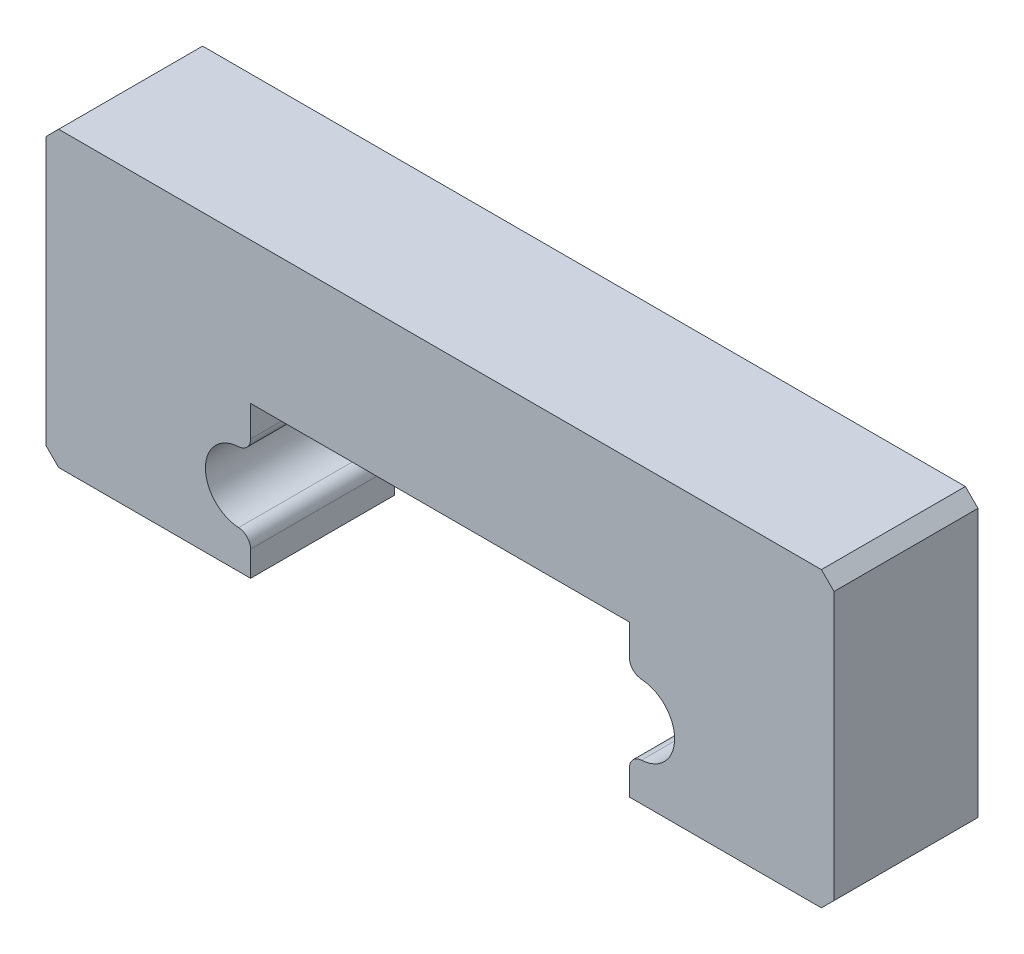
ISO-10303-21;
HEADER;
FILE_DESCRIPTION(('STEP AP214'),'2;1');
FILE_NAME('part.step','',(''),(''),'','','');
FILE_SCHEMA(('AUTOMOTIVE_DESIGN { 1 0 10303 214 1 1 1 1 }'));
ENDSEC;
DATA;
#1=APPLICATION_CONTEXT('core data for automotive mechanical design processes');
#2=APPLICATION_PROTOCOL_DEFINITION('international standard','automotive_design',2000,#1);
#3=PRODUCT_CONTEXT('',#1,'mechanical');
#4=PRODUCT('Part','Part','',(#3));
#5=PRODUCT_RELATED_PRODUCT_CATEGORY('part','',(#4));
#6=PRODUCT_DEFINITION_FORMATION('','',#4);
#7=PRODUCT_DEFINITION_CONTEXT('part definition',#1,'design');
#8=PRODUCT_DEFINITION('design','',#6,#7);
#9=PRODUCT_DEFINITION_SHAPE('','',#8);
#10=(LENGTH_UNIT() NAMED_UNIT(*) SI_UNIT(.MILLI.,.METRE.));
#11=(NAMED_UNIT(*) PLANE_ANGLE_UNIT() SI_UNIT($,.RADIAN.));
#12=(NAMED_UNIT(*) SI_UNIT($,.STERADIAN.) SOLID_ANGLE_UNIT());
#13=UNCERTAINTY_MEASURE_WITH_UNIT(LENGTH_MEASURE(1.E-05),#10,'distance_accuracy_value','');
#14=(GEOMETRIC_REPRESENTATION_CONTEXT(3) GLOBAL_UNCERTAINTY_ASSIGNED_CONTEXT((#13)) GLOBAL_UNIT_ASSIGNED_CONTEXT((#10,
#11,#12)) REPRESENTATION_CONTEXT('',''));
#15=CARTESIAN_POINT('',(0.,0.,0.));
#16=DIRECTION('',(0.,0.,1.));
#17=DIRECTION('',(1.,0.,0.));
#18=AXIS2_PLACEMENT_3D('',#15,#16,#17);
#19=CARTESIAN_POINT('',(7.5,0.,-5.7));
#20=DIRECTION('',(1.,0.,0.));
#21=DIRECTION('',(0.,1.,0.));
#22=AXIS2_PLACEMENT_3D('',#19,#20,#21);
#23=PLANE('',#22);
#24=DIRECTION('',(0.,1.,0.));
#25=VECTOR('',#24,1.);
#26=CARTESIAN_POINT('',(7.5,0.,-5.7));
#27=LINE('',#26,#25);
#28=CARTESIAN_POINT('',(7.5,-1.02364876017217,-5.7));
#29=VERTEX_POINT('',#28);
#30=CARTESIAN_POINT('',(7.5,0.200000000000002,-5.7));
#31=VERTEX_POINT('',#30);
#32=EDGE_CURVE('E274',#29,#31,#27,.T.);
#33=ORIENTED_EDGE('',*,*,#32,.F.);
#34=DIRECTION('',(0.,0.,-1.));
#35=VECTOR('',#34,1.);
#36=CARTESIAN_POINT('',(7.5,-1.02364876017217,0.));
#37=LINE('',#36,#35);
#38=CARTESIAN_POINT('',(7.5,-1.02364876017217,0.));
#39=VERTEX_POINT('',#38);
#40=EDGE_CURVE('E278',#29,#39,#37,.F.);
#41=ORIENTED_EDGE('',*,*,#40,.T.);
#42=DIRECTION('',(0.,1.,0.));
#43=VECTOR('',#42,1.);
#44=CARTESIAN_POINT('',(7.5,0.,0.));
#45=LINE('',#44,#43);
#46=CARTESIAN_POINT('',(7.5,0.200000000000002,0.));
#47=VERTEX_POINT('',#46);
#48=EDGE_CURVE('E235',#39,#47,#45,.T.);
#49=ORIENTED_EDGE('',*,*,#48,.T.);
#50=DIRECTION('',(0.,0.,1.));
#51=VECTOR('',#50,1.);
#52=CARTESIAN_POINT('',(7.5,0.200000000000002,-5.7));
#53=LINE('',#52,#51);
#54=EDGE_CURVE('E275',#31,#47,#53,.T.);
#55=ORIENTED_EDGE('',*,*,#54,.F.);
#56=EDGE_LOOP('',(#33,#41,#49,#55));
#57=FACE_BOUND('',#56,.T.);
#58=ADVANCED_FACE('F45',(#57),#23,.F.);
#59=CARTESIAN_POINT('',(0.,0.200000000000001,-5.7));
#60=DIRECTION('',(0.,-1.,0.));
#61=DIRECTION('',(1.,0.,0.));
#62=AXIS2_PLACEMENT_3D('',#59,#60,#61);
#63=PLANE('',#62);
#64=DIRECTION('',(1.,0.,0.));
#65=VECTOR('',#64,1.);
#66=CARTESIAN_POINT('',(0.,0.200000000000001,0.));
#67=LINE('',#66,#65);
#68=CARTESIAN_POINT('',(-7.5,0.200000000000001,0.));
#69=VERTEX_POINT('',#68);
#70=EDGE_CURVE('E271',#69,#47,#67,.T.);
#71=ORIENTED_EDGE('',*,*,#70,.F.);
#72=DIRECTION('',(0.,0.,1.));
#73=VECTOR('',#72,1.);
#74=CARTESIAN_POINT('',(-7.5,0.200000000000001,-5.7));
#75=LINE('',#74,#73);
#76=CARTESIAN_POINT('',(-7.5,0.200000000000001,-5.7));
#77=VERTEX_POINT('',#76);
#78=EDGE_CURVE('E279',#77,#69,#75,.T.);
#79=ORIENTED_EDGE('',*,*,#78,.F.);
#80=DIRECTION('',(1.,0.,0.));
#81=VECTOR('',#80,1.);
#82=CARTESIAN_POINT('',(0.,0.200000000000001,-5.7));
#83=LINE('',#82,#81);
#84=EDGE_CURVE('E194',#77,#31,#83,.T.);
#85=ORIENTED_EDGE('',*,*,#84,.T.);
#86=ORIENTED_EDGE('',*,*,#54,.T.);
#87=EDGE_LOOP('',(#71,#79,#85,#86));
#88=FACE_BOUND('',#87,.T.);
#89=ADVANCED_FACE('F405',(#88),#63,.T.);
#90=CARTESIAN_POINT('',(-7.5,0.,-5.7));
#91=DIRECTION('',(1.,0.,0.));
#92=DIRECTION('',(0.,1.,0.));
#93=AXIS2_PLACEMENT_3D('',#90,#91,#92);
#94=PLANE('',#93);
#95=DIRECTION('',(0.,1.,0.));
#96=VECTOR('',#95,1.);
#97=CARTESIAN_POINT('',(-7.5,0.,0.));
#98=LINE('',#97,#96);
#99=CARTESIAN_POINT('',(-7.5,-1.02364876017217,0.));
#100=VERTEX_POINT('',#99);
#101=EDGE_CURVE('E269',#100,#69,#98,.T.);
#102=ORIENTED_EDGE('',*,*,#101,.F.);
#103=DIRECTION('',(0.,0.,-1.));
#104=VECTOR('',#103,1.);
#105=CARTESIAN_POINT('',(-7.5,-1.02364876017217,-5.7));
#106=LINE('',#105,#104);
#107=CARTESIAN_POINT('',(-7.5,-1.02364876017217,-5.7));
#108=VERTEX_POINT('',#107);
#109=EDGE_CURVE('E53',#100,#108,#106,.T.);
#110=ORIENTED_EDGE('',*,*,#109,.T.);
#111=DIRECTION('',(0.,1.,0.));
#112=VECTOR('',#111,1.);
#113=CARTESIAN_POINT('',(-7.5,0.,-5.7));
#114=LINE('',#113,#112);
#115=EDGE_CURVE('E231',#108,#77,#114,.T.);
#116=ORIENTED_EDGE('',*,*,#115,.T.);
#117=ORIENTED_EDGE('',*,*,#78,.T.);
#118=EDGE_LOOP('',(#102,#110,#116,#117));
#119=FACE_BOUND('',#118,.T.);
#120=ADVANCED_FACE('F334',(#119),#94,.T.);
#121=CARTESIAN_POINT('',(-7.9,-2.91,-5.7));
#122=DIRECTION('',(0.,0.,1.));
#123=DIRECTION('',(1.,0.,0.));
#124=AXIS2_PLACEMENT_3D('',#121,#122,#123);
#125=CYLINDRICAL_SURFACE('',#124,1.389);
#126=CARTESIAN_POINT('',(-7.9,-2.91,-5.7));
#127=DIRECTION('',(0.,0.,1.));
#128=DIRECTION('',(1.,0.,0.));
#129=AXIS2_PLACEMENT_3D('',#126,#127,#128);
#130=CIRCLE('',#129,1.389);
#131=CARTESIAN_POINT('',(-7.97353096876654,-1.5229476590149,-5.7));
#132=VERTEX_POINT('',#131);
#133=CARTESIAN_POINT('',(-7.97353096876654,-4.2970523409851,-5.7));
#134=VERTEX_POINT('',#133);
#135=EDGE_CURVE('E229',#132,#134,#130,.T.);
#136=ORIENTED_EDGE('',*,*,#135,.F.);
#137=DIRECTION('',(0.,0.,1.));
#138=VECTOR('',#137,1.);
#139=CARTESIAN_POINT('',(-7.97353096876654,-1.5229476590149,-5.7));
#140=LINE('',#139,#138);
#141=CARTESIAN_POINT('',(-7.97353096876654,-1.5229476590149,0.));
#142=VERTEX_POINT('',#141);
#143=EDGE_CURVE('E328',#132,#142,#140,.T.);
#144=ORIENTED_EDGE('',*,*,#143,.T.);
#145=CARTESIAN_POINT('',(-7.9,-2.91,0.));
#146=DIRECTION('',(0.,0.,1.));
#147=DIRECTION('',(1.,0.,0.));
#148=AXIS2_PLACEMENT_3D('',#145,#146,#147);
#149=CIRCLE('',#148,1.389);
#150=CARTESIAN_POINT('',(-7.97353096876654,-4.2970523409851,0.));
#151=VERTEX_POINT('',#150);
#152=EDGE_CURVE('E266',#142,#151,#149,.T.);
#153=ORIENTED_EDGE('',*,*,#152,.T.);
#154=DIRECTION('',(0.,0.,1.));
#155=VECTOR('',#154,1.);
#156=CARTESIAN_POINT('',(-7.97353096876654,-4.2970523409851,-5.7));
#157=LINE('',#156,#155);
#158=EDGE_CURVE('E326',#151,#134,#157,.F.);
#159=ORIENTED_EDGE('',*,*,#158,.T.);
#160=EDGE_LOOP('',(#136,#144,#153,#159));
#161=FACE_BOUND('',#160,.T.);
#162=ADVANCED_FACE('F344',(#161),#125,.F.);
#163=CARTESIAN_POINT('',(-7.5,0.,-5.7));
#164=DIRECTION('',(1.,0.,0.));
#165=DIRECTION('',(0.,0.,-1.));
#166=AXIS2_PLACEMENT_3D('',#163,#164,#165);
#167=PLANE('',#166);
#168=DIRECTION('',(0.,1.,0.));
#169=VECTOR('',#168,1.);
#170=CARTESIAN_POINT('',(-7.5,0.,-5.7));
#171=LINE('',#170,#169);
#172=CARTESIAN_POINT('',(-7.5,-5.8,-5.7));
#173=VERTEX_POINT('',#172);
#174=CARTESIAN_POINT('',(-7.5,-4.79635123982783,-5.7));
#175=VERTEX_POINT('',#174);
#176=EDGE_CURVE('E227',#173,#175,#171,.T.);
#177=ORIENTED_EDGE('',*,*,#176,.T.);
#178=DIRECTION('',(0.,0.,-1.));
#179=VECTOR('',#178,1.);
#180=CARTESIAN_POINT('',(-7.5,-4.79635123982783,0.));
#181=LINE('',#180,#179);
#182=CARTESIAN_POINT('',(-7.5,-4.79635123982783,0.));
#183=VERTEX_POINT('',#182);
#184=EDGE_CURVE('E11',#175,#183,#181,.F.);
#185=ORIENTED_EDGE('',*,*,#184,.T.);
#186=DIRECTION('',(0.,1.,0.));
#187=VECTOR('',#186,1.);
#188=CARTESIAN_POINT('',(-7.5,0.,0.));
#189=LINE('',#188,#187);
#190=CARTESIAN_POINT('',(-7.5,-5.8,0.));
#191=VERTEX_POINT('',#190);
#192=EDGE_CURVE('E263',#191,#183,#189,.T.);
#193=ORIENTED_EDGE('',*,*,#192,.F.);
#194=DIRECTION('',(0.,0.,1.));
#195=VECTOR('',#194,1.);
#196=CARTESIAN_POINT('',(-7.5,-5.8,-5.7));
#197=LINE('',#196,#195);
#198=EDGE_CURVE('E282',#173,#191,#197,.T.);
#199=ORIENTED_EDGE('',*,*,#198,.F.);
#200=EDGE_LOOP('',(#177,#185,#193,#199));
#201=FACE_BOUND('',#200,.T.);
#202=ADVANCED_FACE('F354',(#201),#167,.T.);
#203=CARTESIAN_POINT('',(0.,-5.8,-5.7));
#204=DIRECTION('',(0.,1.,0.));
#205=DIRECTION('',(-1.,0.,0.));
#206=AXIS2_PLACEMENT_3D('',#203,#204,#205);
#207=PLANE('',#206);
#208=DIRECTION('',(-1.,0.,0.));
#209=VECTOR('',#208,1.);
#210=CARTESIAN_POINT('',(0.,-5.8,0.));
#211=LINE('',#210,#209);
#212=CARTESIAN_POINT('',(-15.1,-5.8,0.));
#213=VERTEX_POINT('',#212);
#214=EDGE_CURVE('E261',#191,#213,#211,.T.);
#215=ORIENTED_EDGE('',*,*,#214,.T.);
#216=DIRECTION('',(0.,0.,1.));
#217=VECTOR('',#216,1.);
#218=CARTESIAN_POINT('',(-15.1,-5.8,-5.7));
#219=LINE('',#218,#217);
#220=CARTESIAN_POINT('',(-15.1,-5.8,-5.7));
#221=VERTEX_POINT('',#220);
#222=EDGE_CURVE('E284',#221,#213,#219,.T.);
#223=ORIENTED_EDGE('',*,*,#222,.F.);
#224=DIRECTION('',(-1.,0.,0.));
#225=VECTOR('',#224,1.);
#226=CARTESIAN_POINT('',(0.,-5.8,-5.7));
#227=LINE('',#226,#225);
#228=EDGE_CURVE('E225',#173,#221,#227,.T.);
#229=ORIENTED_EDGE('',*,*,#228,.F.);
#230=ORIENTED_EDGE('',*,*,#198,.T.);
#231=EDGE_LOOP('',(#215,#223,#229,#230));
#232=FACE_BOUND('',#231,.T.);
#233=ADVANCED_FACE('F360',(#232),#207,.F.);
#234=CARTESIAN_POINT('',(-10.45,-10.45,-5.7));
#235=DIRECTION('',(0.707106781186547,0.707106781186548,0.));
#236=DIRECTION('',(-0.707106781186548,0.707106781186547,0.));
#237=AXIS2_PLACEMENT_3D('',#234,#235,#236);
#238=PLANE('',#237);
#239=DIRECTION('',(-0.707106781186548,0.707106781186547,0.));
#240=VECTOR('',#239,1.);
#241=CARTESIAN_POINT('',(-10.45,-10.45,0.));
#242=LINE('',#241,#240);
#243=CARTESIAN_POINT('',(-15.6,-5.3,0.));
#244=VERTEX_POINT('',#243);
#245=EDGE_CURVE('E259',#213,#244,#242,.T.);
#246=ORIENTED_EDGE('',*,*,#245,.T.);
#247=DIRECTION('',(0.,0.,1.));
#248=VECTOR('',#247,1.);
#249=CARTESIAN_POINT('',(-15.6,-5.3,-5.7));
#250=LINE('',#249,#248);
#251=CARTESIAN_POINT('',(-15.6,-5.3,-5.7));
#252=VERTEX_POINT('',#251);
#253=EDGE_CURVE('E287',#252,#244,#250,.T.);
#254=ORIENTED_EDGE('',*,*,#253,.F.);
#255=DIRECTION('',(-0.707106781186548,0.707106781186547,0.));
#256=VECTOR('',#255,1.);
#257=CARTESIAN_POINT('',(-10.45,-10.45,-5.7));
#258=LINE('',#257,#256);
#259=EDGE_CURVE('E223',#221,#252,#258,.T.);
#260=ORIENTED_EDGE('',*,*,#259,.F.);
#261=ORIENTED_EDGE('',*,*,#222,.T.);
#262=EDGE_LOOP('',(#246,#254,#260,#261));
#263=FACE_BOUND('',#262,.T.);
#264=ADVANCED_FACE('F363',(#263),#238,.F.);
#265=CARTESIAN_POINT('',(-15.6,0.,-5.7));
#266=DIRECTION('',(1.,0.,0.));
#267=DIRECTION('',(0.,0.,-1.));
#268=AXIS2_PLACEMENT_3D('',#265,#266,#267);
#269=PLANE('',#268);
#270=DIRECTION('',(0.,1.,0.));
#271=VECTOR('',#270,1.);
#272=CARTESIAN_POINT('',(-15.6,0.,0.));
#273=LINE('',#272,#271);
#274=CARTESIAN_POINT('',(-15.6,5.3,0.));
#275=VERTEX_POINT('',#274);
#276=EDGE_CURVE('E257',#244,#275,#273,.T.);
#277=ORIENTED_EDGE('',*,*,#276,.T.);
#278=DIRECTION('',(0.,0.,1.));
#279=VECTOR('',#278,1.);
#280=CARTESIAN_POINT('',(-15.6,5.3,-5.7));
#281=LINE('',#280,#279);
#282=CARTESIAN_POINT('',(-15.6,5.3,-5.7));
#283=VERTEX_POINT('',#282);
#284=EDGE_CURVE('E290',#283,#275,#281,.T.);
#285=ORIENTED_EDGE('',*,*,#284,.F.);
#286=DIRECTION('',(0.,1.,0.));
#287=VECTOR('',#286,1.);
#288=CARTESIAN_POINT('',(-15.6,0.,-5.7));
#289=LINE('',#288,#287);
#290=EDGE_CURVE('E221',#252,#283,#289,.T.);
#291=ORIENTED_EDGE('',*,*,#290,.F.);
#292=ORIENTED_EDGE('',*,*,#253,.T.);
#293=EDGE_LOOP('',(#277,#285,#291,#292));
#294=FACE_BOUND('',#293,.T.);
#295=ADVANCED_FACE('F368',(#294),#269,.F.);
#296=CARTESIAN_POINT('',(-10.45,10.45,-5.7));
#297=DIRECTION('',(0.707106781186547,-0.707106781186547,0.));
#298=DIRECTION('',(0.707106781186548,0.707106781186548,0.));
#299=AXIS2_PLACEMENT_3D('',#296,#297,#298);
#300=PLANE('',#299);
#301=DIRECTION('',(0.707106781186548,0.707106781186548,0.));
#302=VECTOR('',#301,1.);
#303=CARTESIAN_POINT('',(-10.45,10.45,0.));
#304=LINE('',#303,#302);
#305=CARTESIAN_POINT('',(-15.1,5.8,0.));
#306=VERTEX_POINT('',#305);
#307=EDGE_CURVE('E255',#275,#306,#304,.T.);
#308=ORIENTED_EDGE('',*,*,#307,.T.);
#309=DIRECTION('',(0.,0.,1.));
#310=VECTOR('',#309,1.);
#311=CARTESIAN_POINT('',(-15.1,5.8,-5.7));
#312=LINE('',#311,#310);
#313=CARTESIAN_POINT('',(-15.1,5.8,-5.7));
#314=VERTEX_POINT('',#313);
#315=EDGE_CURVE('E293',#314,#306,#312,.T.);
#316=ORIENTED_EDGE('',*,*,#315,.F.);
#317=DIRECTION('',(0.707106781186548,0.707106781186548,0.));
#318=VECTOR('',#317,1.);
#319=CARTESIAN_POINT('',(-10.45,10.45,-5.7));
#320=LINE('',#319,#318);
#321=EDGE_CURVE('E219',#283,#314,#320,.T.);
#322=ORIENTED_EDGE('',*,*,#321,.F.);
#323=ORIENTED_EDGE('',*,*,#284,.T.);
#324=EDGE_LOOP('',(#308,#316,#322,#323));
#325=FACE_BOUND('',#324,.T.);
#326=ADVANCED_FACE('F375',(#325),#300,.F.);
#327=CARTESIAN_POINT('',(0.,5.8,-5.7));
#328=DIRECTION('',(0.,-1.,0.));
#329=DIRECTION('',(1.,0.,0.));
#330=AXIS2_PLACEMENT_3D('',#327,#328,#329);
#331=PLANE('',#330);
#332=DIRECTION('',(1.,0.,0.));
#333=VECTOR('',#332,1.);
#334=CARTESIAN_POINT('',(0.,5.8,0.));
#335=LINE('',#334,#333);
#336=CARTESIAN_POINT('',(15.1,5.8,0.));
#337=VERTEX_POINT('',#336);
#338=EDGE_CURVE('E252',#306,#337,#335,.T.);
#339=ORIENTED_EDGE('',*,*,#338,.T.);
#340=DIRECTION('',(0.,0.,1.));
#341=VECTOR('',#340,1.);
#342=CARTESIAN_POINT('',(15.1,5.8,-5.7));
#343=LINE('',#342,#341);
#344=CARTESIAN_POINT('',(15.1,5.8,-5.7));
#345=VERTEX_POINT('',#344);
#346=EDGE_CURVE('E296',#345,#337,#343,.T.);
#347=ORIENTED_EDGE('',*,*,#346,.F.);
#348=DIRECTION('',(1.,0.,0.));
#349=VECTOR('',#348,1.);
#350=CARTESIAN_POINT('',(0.,5.8,-5.7));
#351=LINE('',#350,#349);
#352=EDGE_CURVE('E217',#314,#345,#351,.T.);
#353=ORIENTED_EDGE('',*,*,#352,.F.);
#354=ORIENTED_EDGE('',*,*,#315,.T.);
#355=EDGE_LOOP('',(#339,#347,#353,#354));
#356=FACE_BOUND('',#355,.T.);
#357=ADVANCED_FACE('F379',(#356),#331,.F.);
#358=CARTESIAN_POINT('',(10.45,10.45,-5.7));
#359=DIRECTION('',(0.707106781186547,0.707106781186547,0.));
#360=DIRECTION('',(-0.707106781186548,0.707106781186548,0.));
#361=AXIS2_PLACEMENT_3D('',#358,#359,#360);
#362=PLANE('',#361);
#363=DIRECTION('',(-0.707106781186548,0.707106781186548,0.));
#364=VECTOR('',#363,1.);
#365=CARTESIAN_POINT('',(10.45,10.45,0.));
#366=LINE('',#365,#364);
#367=CARTESIAN_POINT('',(15.6,5.3,0.));
#368=VERTEX_POINT('',#367);
#369=EDGE_CURVE('E249',#368,#337,#366,.T.);
#370=ORIENTED_EDGE('',*,*,#369,.F.);
#371=DIRECTION('',(0.,0.,1.));
#372=VECTOR('',#371,1.);
#373=CARTESIAN_POINT('',(15.6,5.3,-5.7));
#374=LINE('',#373,#372);
#375=CARTESIAN_POINT('',(15.6,5.3,-5.7));
#376=VERTEX_POINT('',#375);
#377=EDGE_CURVE('E298',#376,#368,#374,.T.);
#378=ORIENTED_EDGE('',*,*,#377,.F.);
#379=DIRECTION('',(-0.707106781186548,0.707106781186548,0.));
#380=VECTOR('',#379,1.);
#381=CARTESIAN_POINT('',(10.45,10.45,-5.7));
#382=LINE('',#381,#380);
#383=EDGE_CURVE('E214',#376,#345,#382,.T.);
#384=ORIENTED_EDGE('',*,*,#383,.T.);
#385=ORIENTED_EDGE('',*,*,#346,.T.);
#386=EDGE_LOOP('',(#370,#378,#384,#385));
#387=FACE_BOUND('',#386,.T.);
#388=ADVANCED_FACE('F382',(#387),#362,.T.);
#389=CARTESIAN_POINT('',(15.6,0.,-5.7));
#390=DIRECTION('',(1.,0.,0.));
#391=DIRECTION('',(0.,1.,0.));
#392=AXIS2_PLACEMENT_3D('',#389,#390,#391);
#393=PLANE('',#392);
#394=DIRECTION('',(0.,1.,0.));
#395=VECTOR('',#394,1.);
#396=CARTESIAN_POINT('',(15.6,0.,0.));
#397=LINE('',#396,#395);
#398=CARTESIAN_POINT('',(15.6,-5.3,0.));
#399=VERTEX_POINT('',#398);
#400=EDGE_CURVE('E246',#399,#368,#397,.T.);
#401=ORIENTED_EDGE('',*,*,#400,.F.);
#402=DIRECTION('',(0.,0.,1.));
#403=VECTOR('',#402,1.);
#404=CARTESIAN_POINT('',(15.6,-5.3,-5.7));
#405=LINE('',#404,#403);
#406=CARTESIAN_POINT('',(15.6,-5.3,-5.7));
#407=VERTEX_POINT('',#406);
#408=EDGE_CURVE('E300',#407,#399,#405,.T.);
#409=ORIENTED_EDGE('',*,*,#408,.F.);
#410=DIRECTION('',(0.,1.,0.));
#411=VECTOR('',#410,1.);
#412=CARTESIAN_POINT('',(15.6,0.,-5.7));
#413=LINE('',#412,#411);
#414=EDGE_CURVE('E208',#407,#376,#413,.T.);
#415=ORIENTED_EDGE('',*,*,#414,.T.);
#416=ORIENTED_EDGE('',*,*,#377,.T.);
#417=EDGE_LOOP('',(#401,#409,#415,#416));
#418=FACE_BOUND('',#417,.T.);
#419=ADVANCED_FACE('F385',(#418),#393,.T.);
#420=CARTESIAN_POINT('',(10.45,-10.45,-5.7));
#421=DIRECTION('',(0.707106781186547,-0.707106781186548,0.));
#422=DIRECTION('',(0.707106781186548,0.707106781186547,0.));
#423=AXIS2_PLACEMENT_3D('',#420,#421,#422);
#424=PLANE('',#423);
#425=DIRECTION('',(0.707106781186548,0.707106781186547,0.));
#426=VECTOR('',#425,1.);
#427=CARTESIAN_POINT('',(10.45,-10.45,0.));
#428=LINE('',#427,#426);
#429=CARTESIAN_POINT('',(15.1,-5.8,0.));
#430=VERTEX_POINT('',#429);
#431=EDGE_CURVE('E243',#430,#399,#428,.T.);
#432=ORIENTED_EDGE('',*,*,#431,.F.);
#433=DIRECTION('',(0.,0.,1.));
#434=VECTOR('',#433,1.);
#435=CARTESIAN_POINT('',(15.1,-5.8,-5.7));
#436=LINE('',#435,#434);
#437=CARTESIAN_POINT('',(15.1,-5.8,-5.7));
#438=VERTEX_POINT('',#437);
#439=EDGE_CURVE('E193',#438,#430,#436,.T.);
#440=ORIENTED_EDGE('',*,*,#439,.F.);
#441=DIRECTION('',(0.707106781186548,0.707106781186547,0.));
#442=VECTOR('',#441,1.);
#443=CARTESIAN_POINT('',(10.45,-10.45,-5.7));
#444=LINE('',#443,#442);
#445=EDGE_CURVE('E206',#438,#407,#444,.T.);
#446=ORIENTED_EDGE('',*,*,#445,.T.);
#447=ORIENTED_EDGE('',*,*,#408,.T.);
#448=EDGE_LOOP('',(#432,#440,#446,#447));
#449=FACE_BOUND('',#448,.T.);
#450=ADVANCED_FACE('F388',(#449),#424,.T.);
#451=CARTESIAN_POINT('',(0.,-5.8,-5.7));
#452=DIRECTION('',(0.,-1.,0.));
#453=DIRECTION('',(1.,0.,0.));
#454=AXIS2_PLACEMENT_3D('',#451,#452,#453);
#455=PLANE('',#454);
#456=DIRECTION('',(1.,0.,0.));
#457=VECTOR('',#456,1.);
#458=CARTESIAN_POINT('',(0.,-5.8,0.));
#459=LINE('',#458,#457);
#460=CARTESIAN_POINT('',(7.5,-5.8,0.));
#461=VERTEX_POINT('',#460);
#462=EDGE_CURVE('E191',#461,#430,#459,.T.);
#463=ORIENTED_EDGE('',*,*,#462,.F.);
#464=DIRECTION('',(0.,0.,1.));
#465=VECTOR('',#464,1.);
#466=CARTESIAN_POINT('',(7.5,-5.8,-5.7));
#467=LINE('',#466,#465);
#468=CARTESIAN_POINT('',(7.5,-5.8,-5.7));
#469=VERTEX_POINT('',#468);
#470=EDGE_CURVE('E186',#469,#461,#467,.T.);
#471=ORIENTED_EDGE('',*,*,#470,.F.);
#472=DIRECTION('',(1.,0.,0.));
#473=VECTOR('',#472,1.);
#474=CARTESIAN_POINT('',(0.,-5.8,-5.7));
#475=LINE('',#474,#473);
#476=EDGE_CURVE('E189',#469,#438,#475,.T.);
#477=ORIENTED_EDGE('',*,*,#476,.T.);
#478=ORIENTED_EDGE('',*,*,#439,.T.);
#479=EDGE_LOOP('',(#463,#471,#477,#478));
#480=FACE_BOUND('',#479,.T.);
#481=ADVANCED_FACE('F187',(#480),#455,.T.);
#482=CARTESIAN_POINT('',(7.5,0.,-5.7));
#483=DIRECTION('',(1.,0.,0.));
#484=DIRECTION('',(0.,0.,-1.));
#485=AXIS2_PLACEMENT_3D('',#482,#483,#484);
#486=PLANE('',#485);
#487=DIRECTION('',(0.,1.,0.));
#488=VECTOR('',#487,1.);
#489=CARTESIAN_POINT('',(7.5,0.,0.));
#490=LINE('',#489,#488);
#491=CARTESIAN_POINT('',(7.5,-4.79635123982783,0.));
#492=VERTEX_POINT('',#491);
#493=EDGE_CURVE('E240',#461,#492,#490,.T.);
#494=ORIENTED_EDGE('',*,*,#493,.T.);
#495=DIRECTION('',(0.,0.,-1.));
#496=VECTOR('',#495,1.);
#497=CARTESIAN_POINT('',(7.5,-4.79635123982783,-5.7));
#498=LINE('',#497,#496);
#499=CARTESIAN_POINT('',(7.5,-4.79635123982783,-5.7));
#500=VERTEX_POINT('',#499);
#501=EDGE_CURVE('E60',#492,#500,#498,.T.);
#502=ORIENTED_EDGE('',*,*,#501,.T.);
#503=DIRECTION('',(0.,1.,0.));
#504=VECTOR('',#503,1.);
#505=CARTESIAN_POINT('',(7.5,0.,-5.7));
#506=LINE('',#505,#504);
#507=EDGE_CURVE('E196',#469,#500,#506,.T.);
#508=ORIENTED_EDGE('',*,*,#507,.F.);
#509=ORIENTED_EDGE('',*,*,#470,.T.);
#510=EDGE_LOOP('',(#494,#502,#508,#509));
#511=FACE_BOUND('',#510,.T.);
#512=ADVANCED_FACE('F197',(#511),#486,.F.);
#513=CARTESIAN_POINT('',(7.9,-2.91,-5.7));
#514=DIRECTION('',(0.,0.,1.));
#515=DIRECTION('',(1.,0.,0.));
#516=AXIS2_PLACEMENT_3D('',#513,#514,#515);
#517=CYLINDRICAL_SURFACE('',#516,1.389);
#518=CARTESIAN_POINT('',(7.9,-2.91,0.));
#519=DIRECTION('',(0.,0.,1.));
#520=DIRECTION('',(1.,0.,0.));
#521=AXIS2_PLACEMENT_3D('',#518,#519,#520);
#522=CIRCLE('',#521,1.389);
#523=CARTESIAN_POINT('',(7.97353096876654,-1.52294765901489,0.));
#524=VERTEX_POINT('',#523);
#525=CARTESIAN_POINT('',(7.97353096876654,-4.2970523409851,0.));
#526=VERTEX_POINT('',#525);
#527=EDGE_CURVE('E237',#524,#526,#522,.F.);
#528=ORIENTED_EDGE('',*,*,#527,.F.);
#529=DIRECTION('',(0.,0.,1.));
#530=VECTOR('',#529,1.);
#531=CARTESIAN_POINT('',(7.97353096876654,-1.52294765901489,-5.7));
#532=LINE('',#531,#530);
#533=CARTESIAN_POINT('',(7.97353096876654,-1.52294765901489,-5.7));
#534=VERTEX_POINT('',#533);
#535=EDGE_CURVE('E316',#524,#534,#532,.F.);
#536=ORIENTED_EDGE('',*,*,#535,.T.);
#537=CARTESIAN_POINT('',(7.9,-2.91,-5.7));
#538=DIRECTION('',(0.,0.,1.));
#539=DIRECTION('',(1.,0.,0.));
#540=AXIS2_PLACEMENT_3D('',#537,#538,#539);
#541=CIRCLE('',#540,1.389);
#542=CARTESIAN_POINT('',(7.97353096876654,-4.2970523409851,-5.7));
#543=VERTEX_POINT('',#542);
#544=EDGE_CURVE('E199',#534,#543,#541,.F.);
#545=ORIENTED_EDGE('',*,*,#544,.T.);
#546=DIRECTION('',(0.,0.,1.));
#547=VECTOR('',#546,1.);
#548=CARTESIAN_POINT('',(7.97353096876654,-4.2970523409851,-5.7));
#549=LINE('',#548,#547);
#550=EDGE_CURVE('E313',#543,#526,#549,.T.);
#551=ORIENTED_EDGE('',*,*,#550,.T.);
#552=EDGE_LOOP('',(#528,#536,#545,#551));
#553=FACE_BOUND('',#552,.T.);
#554=ADVANCED_FACE('F396',(#553),#517,.F.);
#555=CARTESIAN_POINT('',(0.,0.,-5.7));
#556=DIRECTION('',(0.,0.,1.));
#557=DIRECTION('',(1.,0.,0.));
#558=AXIS2_PLACEMENT_3D('',#555,#556,#557);
#559=PLANE('',#558);
#560=ORIENTED_EDGE('',*,*,#544,.F.);
#561=CARTESIAN_POINT('',(8.,-1.02364876017217,-5.7));
#562=DIRECTION('',(0.,0.,1.));
#563=DIRECTION('',(1.,0.,0.));
#564=AXIS2_PLACEMENT_3D('',#561,#562,#563);
#565=CIRCLE('',#564,0.5);
#566=EDGE_CURVE('E323',#534,#29,#565,.F.);
#567=ORIENTED_EDGE('',*,*,#566,.T.);
#568=ORIENTED_EDGE('',*,*,#32,.T.);
#569=ORIENTED_EDGE('',*,*,#84,.F.);
#570=ORIENTED_EDGE('',*,*,#115,.F.);
#571=CARTESIAN_POINT('',(-8.,-1.02364876017217,-5.7));
#572=DIRECTION('',(0.,0.,1.));
#573=DIRECTION('',(1.,0.,0.));
#574=AXIS2_PLACEMENT_3D('',#571,#572,#573);
#575=CIRCLE('',#574,0.5);
#576=EDGE_CURVE('E319',#108,#132,#575,.F.);
#577=ORIENTED_EDGE('',*,*,#576,.T.);
#578=ORIENTED_EDGE('',*,*,#135,.T.);
#579=CARTESIAN_POINT('',(-8.,-4.79635123982783,-5.7));
#580=DIRECTION('',(0.,0.,1.));
#581=DIRECTION('',(1.,0.,0.));
#582=AXIS2_PLACEMENT_3D('',#579,#580,#581);
#583=CIRCLE('',#582,0.5);
#584=EDGE_CURVE('E68',#134,#175,#583,.F.);
#585=ORIENTED_EDGE('',*,*,#584,.T.);
#586=ORIENTED_EDGE('',*,*,#176,.F.);
#587=ORIENTED_EDGE('',*,*,#228,.T.);
#588=ORIENTED_EDGE('',*,*,#259,.T.);
#589=ORIENTED_EDGE('',*,*,#290,.T.);
#590=ORIENTED_EDGE('',*,*,#321,.T.);
#591=ORIENTED_EDGE('',*,*,#352,.T.);
#592=ORIENTED_EDGE('',*,*,#383,.F.);
#593=ORIENTED_EDGE('',*,*,#414,.F.);
#594=ORIENTED_EDGE('',*,*,#445,.F.);
#595=ORIENTED_EDGE('',*,*,#476,.F.);
#596=ORIENTED_EDGE('',*,*,#507,.T.);
#597=CARTESIAN_POINT('',(8.,-4.79635123982783,-5.7));
#598=DIRECTION('',(0.,0.,1.));
#599=DIRECTION('',(1.,0.,0.));
#600=AXIS2_PLACEMENT_3D('',#597,#598,#599);
#601=CIRCLE('',#600,0.5);
#602=EDGE_CURVE('E321',#500,#543,#601,.F.);
#603=ORIENTED_EDGE('',*,*,#602,.T.);
#604=EDGE_LOOP('',(#560,#567,#568,#569,#570,#577,#578,#585,#586,#587,#588,#589,#590,#591,#592,
#593,#594,#595,#596,#603));
#605=FACE_BOUND('',#604,.T.);
#606=ADVANCED_FACE('F203',(#605),#559,.F.);
#607=CARTESIAN_POINT('',(0.,0.,0.));
#608=DIRECTION('',(0.,0.,1.));
#609=DIRECTION('',(1.,0.,0.));
#610=AXIS2_PLACEMENT_3D('',#607,#608,#609);
#611=PLANE('',#610);
#612=ORIENTED_EDGE('',*,*,#48,.F.);
#613=CARTESIAN_POINT('',(8.,-1.02364876017217,0.));
#614=DIRECTION('',(0.,0.,1.));
#615=DIRECTION('',(1.,0.,0.));
#616=AXIS2_PLACEMENT_3D('',#613,#614,#615);
#617=CIRCLE('',#616,0.5);
#618=EDGE_CURVE('E311',#39,#524,#617,.T.);
#619=ORIENTED_EDGE('',*,*,#618,.T.);
#620=ORIENTED_EDGE('',*,*,#527,.T.);
#621=CARTESIAN_POINT('',(8.,-4.79635123982783,0.));
#622=DIRECTION('',(0.,0.,1.));
#623=DIRECTION('',(1.,0.,0.));
#624=AXIS2_PLACEMENT_3D('',#621,#622,#623);
#625=CIRCLE('',#624,0.5);
#626=EDGE_CURVE('E309',#526,#492,#625,.T.);
#627=ORIENTED_EDGE('',*,*,#626,.T.);
#628=ORIENTED_EDGE('',*,*,#493,.F.);
#629=ORIENTED_EDGE('',*,*,#462,.T.);
#630=ORIENTED_EDGE('',*,*,#431,.T.);
#631=ORIENTED_EDGE('',*,*,#400,.T.);
#632=ORIENTED_EDGE('',*,*,#369,.T.);
#633=ORIENTED_EDGE('',*,*,#338,.F.);
#634=ORIENTED_EDGE('',*,*,#307,.F.);
#635=ORIENTED_EDGE('',*,*,#276,.F.);
#636=ORIENTED_EDGE('',*,*,#245,.F.);
#637=ORIENTED_EDGE('',*,*,#214,.F.);
#638=ORIENTED_EDGE('',*,*,#192,.T.);
#639=CARTESIAN_POINT('',(-8.,-4.79635123982783,0.));
#640=DIRECTION('',(0.,0.,1.));
#641=DIRECTION('',(1.,0.,0.));
#642=AXIS2_PLACEMENT_3D('',#639,#640,#641);
#643=CIRCLE('',#642,0.5);
#644=EDGE_CURVE('E305',#183,#151,#643,.T.);
#645=ORIENTED_EDGE('',*,*,#644,.T.);
#646=ORIENTED_EDGE('',*,*,#152,.F.);
#647=CARTESIAN_POINT('',(-8.,-1.02364876017217,0.));
#648=DIRECTION('',(0.,0.,1.));
#649=DIRECTION('',(1.,0.,0.));
#650=AXIS2_PLACEMENT_3D('',#647,#648,#649);
#651=CIRCLE('',#650,0.5);
#652=EDGE_CURVE('E307',#142,#100,#651,.T.);
#653=ORIENTED_EDGE('',*,*,#652,.T.);
#654=ORIENTED_EDGE('',*,*,#101,.T.);
#655=ORIENTED_EDGE('',*,*,#70,.T.);
#656=EDGE_LOOP('',(#612,#619,#620,#627,#628,#629,#630,#631,#632,#633,#634,#635,#636,#637,#638,
#645,#646,#653,#654,#655));
#657=FACE_BOUND('',#656,.T.);
#658=ADVANCED_FACE('F348',(#657),#611,.T.);
#659=CARTESIAN_POINT('',(8.,-1.02364876017217,-5.7));
#660=DIRECTION('',(0.,0.,1.));
#661=DIRECTION('',(1.,0.,0.));
#662=AXIS2_PLACEMENT_3D('',#659,#660,#661);
#663=CYLINDRICAL_SURFACE('',#662,0.5);
#664=ORIENTED_EDGE('',*,*,#566,.F.);
#665=ORIENTED_EDGE('',*,*,#535,.F.);
#666=ORIENTED_EDGE('',*,*,#618,.F.);
#667=ORIENTED_EDGE('',*,*,#40,.F.);
#668=EDGE_LOOP('',(#664,#665,#666,#667));
#669=FACE_BOUND('',#668,.T.);
#670=ADVANCED_FACE('F407',(#669),#663,.T.);
#671=CARTESIAN_POINT('',(8.,-4.79635123982783,-5.7));
#672=DIRECTION('',(0.,0.,1.));
#673=DIRECTION('',(1.,0.,0.));
#674=AXIS2_PLACEMENT_3D('',#671,#672,#673);
#675=CYLINDRICAL_SURFACE('',#674,0.5);
#676=ORIENTED_EDGE('',*,*,#602,.F.);
#677=ORIENTED_EDGE('',*,*,#501,.F.);
#678=ORIENTED_EDGE('',*,*,#626,.F.);
#679=ORIENTED_EDGE('',*,*,#550,.F.);
#680=EDGE_LOOP('',(#676,#677,#678,#679));
#681=FACE_BOUND('',#680,.T.);
#682=ADVANCED_FACE('F390',(#681),#675,.T.);
#683=CARTESIAN_POINT('',(-8.,-1.02364876017217,-5.7));
#684=DIRECTION('',(0.,0.,1.));
#685=DIRECTION('',(1.,0.,0.));
#686=AXIS2_PLACEMENT_3D('',#683,#684,#685);
#687=CYLINDRICAL_SURFACE('',#686,0.5);
#688=ORIENTED_EDGE('',*,*,#576,.F.);
#689=ORIENTED_EDGE('',*,*,#109,.F.);
#690=ORIENTED_EDGE('',*,*,#652,.F.);
#691=ORIENTED_EDGE('',*,*,#143,.F.);
#692=EDGE_LOOP('',(#688,#689,#690,#691));
#693=FACE_BOUND('',#692,.T.);
#694=ADVANCED_FACE('F341',(#693),#687,.T.);
#695=CARTESIAN_POINT('',(-8.,-4.79635123982783,-5.7));
#696=DIRECTION('',(0.,0.,1.));
#697=DIRECTION('',(1.,0.,0.));
#698=AXIS2_PLACEMENT_3D('',#695,#696,#697);
#699=CYLINDRICAL_SURFACE('',#698,0.5);
#700=ORIENTED_EDGE('',*,*,#584,.F.);
#701=ORIENTED_EDGE('',*,*,#158,.F.);
#702=ORIENTED_EDGE('',*,*,#644,.F.);
#703=ORIENTED_EDGE('',*,*,#184,.F.);
#704=EDGE_LOOP('',(#700,#701,#702,#703));
#705=FACE_BOUND('',#704,.T.);
#706=ADVANCED_FACE('F47',(#705),#699,.T.);
#707=CLOSED_SHELL('',(#58,#89,#120,#162,#202,#233,#264,#295,#326,#357,#388,#419,#450,#481,#512,
#554,#606,#658,#670,#682,#694,#706));
#708=MANIFOLD_SOLID_BREP('B2',#707);
#709=ADVANCED_BREP_SHAPE_REPRESENTATION('',(#18,#708),#14);
#710=SHAPE_DEFINITION_REPRESENTATION(#9,#709);
ENDSEC;
END-ISO-10303-21;
